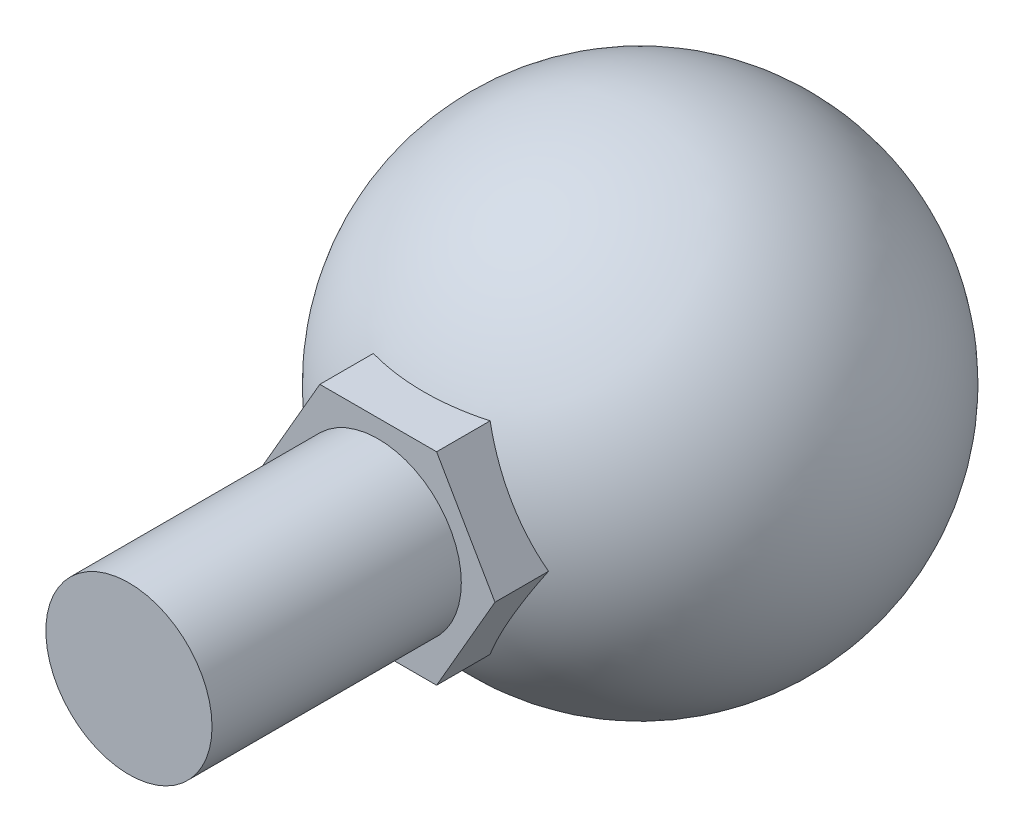
ISO-10303-21;
HEADER;
FILE_DESCRIPTION(('STEP AP214'),'2;1');
FILE_NAME('part.step','',(''),(''),'','','');
FILE_SCHEMA(('AUTOMOTIVE_DESIGN { 1 0 10303 214 1 1 1 1 }'));
ENDSEC;
DATA;
#1=APPLICATION_CONTEXT('core data for automotive mechanical design processes');
#2=APPLICATION_PROTOCOL_DEFINITION('international standard','automotive_design',2000,#1);
#3=PRODUCT_CONTEXT('',#1,'mechanical');
#4=PRODUCT('Part','Part','',(#3));
#5=PRODUCT_RELATED_PRODUCT_CATEGORY('part','',(#4));
#6=PRODUCT_DEFINITION_FORMATION('','',#4);
#7=PRODUCT_DEFINITION_CONTEXT('part definition',#1,'design');
#8=PRODUCT_DEFINITION('design','',#6,#7);
#9=PRODUCT_DEFINITION_SHAPE('','',#8);
#10=(LENGTH_UNIT() NAMED_UNIT(*) SI_UNIT(.MILLI.,.METRE.));
#11=(NAMED_UNIT(*) PLANE_ANGLE_UNIT() SI_UNIT($,.RADIAN.));
#12=(NAMED_UNIT(*) SI_UNIT($,.STERADIAN.) SOLID_ANGLE_UNIT());
#13=UNCERTAINTY_MEASURE_WITH_UNIT(LENGTH_MEASURE(1.E-05),#10,'distance_accuracy_value','');
#14=(GEOMETRIC_REPRESENTATION_CONTEXT(3) GLOBAL_UNCERTAINTY_ASSIGNED_CONTEXT((#13)) GLOBAL_UNIT_ASSIGNED_CONTEXT((#10,
#11,#12)) REPRESENTATION_CONTEXT('',''));
#15=CARTESIAN_POINT('',(0.,0.,0.));
#16=DIRECTION('',(0.,0.,1.));
#17=DIRECTION('',(1.,0.,0.));
#18=AXIS2_PLACEMENT_3D('',#15,#16,#17);
#19=CARTESIAN_POINT('',(0.,0.,24.6101446790841));
#20=DIRECTION('',(0.,0.,1.));
#21=DIRECTION('',(1.,0.,0.));
#22=AXIS2_PLACEMENT_3D('',#19,#20,#21);
#23=CYLINDRICAL_SURFACE('',#22,4.);
#24=CARTESIAN_POINT('',(0.,0.,12.6101446790841));
#25=DIRECTION('',(0.,0.,1.));
#26=DIRECTION('',(1.,0.,0.));
#27=AXIS2_PLACEMENT_3D('',#24,#25,#26);
#28=CIRCLE('',#27,4.);
#29=CARTESIAN_POINT('',(4.,0.,12.6101446790841));
#30=VERTEX_POINT('',#29);
#31=EDGE_CURVE('E115',#30,#30,#28,.T.);
#32=ORIENTED_EDGE('',*,*,#31,.T.);
#33=EDGE_LOOP('',(#32));
#34=FACE_BOUND('',#33,.T.);
#35=CARTESIAN_POINT('',(0.,0.,24.6101446790841));
#36=DIRECTION('',(0.,0.,1.));
#37=DIRECTION('',(1.,0.,0.));
#38=AXIS2_PLACEMENT_3D('',#35,#36,#37);
#39=CIRCLE('',#38,4.);
#40=CARTESIAN_POINT('',(4.,0.,24.6101446790841));
#41=VERTEX_POINT('',#40);
#42=EDGE_CURVE('E121',#41,#41,#39,.T.);
#43=ORIENTED_EDGE('',*,*,#42,.F.);
#44=EDGE_LOOP('',(#43));
#45=FACE_BOUND('',#44,.T.);
#46=ADVANCED_FACE('F41',(#34,#45),#23,.T.);
#47=CARTESIAN_POINT('',(-4.,0.,24.6101446790841));
#48=DIRECTION('',(0.,0.,-1.));
#49=DIRECTION('',(-1.,0.,0.));
#50=AXIS2_PLACEMENT_3D('',#47,#48,#49);
#51=PLANE('',#50);
#52=ORIENTED_EDGE('',*,*,#42,.T.);
#53=EDGE_LOOP('',(#52));
#54=FACE_BOUND('',#53,.T.);
#55=ADVANCED_FACE('F190',(#54),#51,.F.);
#56=CARTESIAN_POINT('',(5.62055704149006,0.,12.6101446790841));
#57=DIRECTION('',(-0.866025403784438,-0.5,0.));
#58=DIRECTION('',(0.5,-0.866025403784439,0.));
#59=AXIS2_PLACEMENT_3D('',#56,#57,#58);
#60=PLANE('',#59);
#61=DIRECTION('',(0.,0.,-1.));
#62=VECTOR('',#61,1.);
#63=CARTESIAN_POINT('',(5.62055704149006,0.,12.6101446790841));
#64=LINE('',#63,#62);
#65=CARTESIAN_POINT('',(5.62055704149006,0.,12.6101446790841));
#66=VERTEX_POINT('',#65);
#67=CARTESIAN_POINT('',(5.62055704149006,0.,10.0329127646639));
#68=VERTEX_POINT('',#67);
#69=EDGE_CURVE('E162',#66,#68,#64,.T.);
#70=ORIENTED_EDGE('',*,*,#69,.T.);
#71=CARTESIAN_POINT('',(4.21541778111754,2.43377259067495,0.));
#72=DIRECTION('',(-0.866025403784438,-0.5,0.));
#73=DIRECTION('',(0.5,-0.866025403784439,0.));
#74=AXIS2_PLACEMENT_3D('',#71,#72,#73);
#75=CIRCLE('',#74,10.4190692438201);
#76=CARTESIAN_POINT('',(2.81027852074503,4.8675451813499,10.0329127646639));
#77=VERTEX_POINT('',#76);
#78=EDGE_CURVE('E11',#68,#77,#75,.T.);
#79=ORIENTED_EDGE('',*,*,#78,.T.);
#80=DIRECTION('',(0.,0.,-1.));
#81=VECTOR('',#80,1.);
#82=CARTESIAN_POINT('',(2.81027852074503,4.8675451813499,12.6101446790841));
#83=LINE('',#82,#81);
#84=CARTESIAN_POINT('',(2.81027852074503,4.8675451813499,12.6101446790841));
#85=VERTEX_POINT('',#84);
#86=EDGE_CURVE('E95',#85,#77,#83,.T.);
#87=ORIENTED_EDGE('',*,*,#86,.F.);
#88=DIRECTION('',(-0.5,0.866025403784439,0.));
#89=VECTOR('',#88,1.);
#90=CARTESIAN_POINT('',(5.62055704149006,0.,12.6101446790841));
#91=LINE('',#90,#89);
#92=EDGE_CURVE('E102',#66,#85,#91,.T.);
#93=ORIENTED_EDGE('',*,*,#92,.F.);
#94=EDGE_LOOP('',(#70,#79,#87,#93));
#95=FACE_BOUND('',#94,.T.);
#96=ADVANCED_FACE('F113',(#95),#60,.F.);
#97=CARTESIAN_POINT('',(2.81027852074503,4.8675451813499,12.6101446790841));
#98=DIRECTION('',(0.,-1.,0.));
#99=DIRECTION('',(1.,0.,0.));
#100=AXIS2_PLACEMENT_3D('',#97,#98,#99);
#101=PLANE('',#100);
#102=ORIENTED_EDGE('',*,*,#86,.T.);
#103=CARTESIAN_POINT('',(0.,4.8675451813499,0.));
#104=DIRECTION('',(0.,-1.,0.));
#105=DIRECTION('',(1.,0.,0.));
#106=AXIS2_PLACEMENT_3D('',#103,#104,#105);
#107=CIRCLE('',#106,10.4190692438201);
#108=CARTESIAN_POINT('',(-2.81027852074503,4.8675451813499,10.0329127646639));
#109=VERTEX_POINT('',#108);
#110=EDGE_CURVE('E50',#77,#109,#107,.T.);
#111=ORIENTED_EDGE('',*,*,#110,.T.);
#112=DIRECTION('',(0.,0.,-1.));
#113=VECTOR('',#112,1.);
#114=CARTESIAN_POINT('',(-2.81027852074503,4.8675451813499,12.6101446790841));
#115=LINE('',#114,#113);
#116=CARTESIAN_POINT('',(-2.81027852074503,4.8675451813499,12.6101446790841));
#117=VERTEX_POINT('',#116);
#118=EDGE_CURVE('E97',#117,#109,#115,.T.);
#119=ORIENTED_EDGE('',*,*,#118,.F.);
#120=DIRECTION('',(-1.,0.,0.));
#121=VECTOR('',#120,1.);
#122=CARTESIAN_POINT('',(2.81027852074503,4.8675451813499,12.6101446790841));
#123=LINE('',#122,#121);
#124=EDGE_CURVE('E91',#85,#117,#123,.T.);
#125=ORIENTED_EDGE('',*,*,#124,.F.);
#126=EDGE_LOOP('',(#102,#111,#119,#125));
#127=FACE_BOUND('',#126,.T.);
#128=ADVANCED_FACE('F93',(#127),#101,.F.);
#129=CARTESIAN_POINT('',(-2.81027852074503,4.8675451813499,12.6101446790841));
#130=DIRECTION('',(0.866025403784439,-0.5,0.));
#131=DIRECTION('',(0.5,0.866025403784439,0.));
#132=AXIS2_PLACEMENT_3D('',#129,#130,#131);
#133=PLANE('',#132);
#134=ORIENTED_EDGE('',*,*,#118,.T.);
#135=CARTESIAN_POINT('',(-4.21541778111755,2.43377259067495,0.));
#136=DIRECTION('',(0.866025403784439,-0.5,0.));
#137=DIRECTION('',(0.5,0.866025403784439,0.));
#138=AXIS2_PLACEMENT_3D('',#135,#136,#137);
#139=CIRCLE('',#138,10.4190692438201);
#140=CARTESIAN_POINT('',(-5.62055704149006,0.,10.0329127646639));
#141=VERTEX_POINT('',#140);
#142=EDGE_CURVE('E60',#109,#141,#139,.T.);
#143=ORIENTED_EDGE('',*,*,#142,.T.);
#144=DIRECTION('',(0.,0.,-1.));
#145=VECTOR('',#144,1.);
#146=CARTESIAN_POINT('',(-5.62055704149006,0.,12.6101446790841));
#147=LINE('',#146,#145);
#148=CARTESIAN_POINT('',(-5.62055704149006,0.,12.6101446790841));
#149=VERTEX_POINT('',#148);
#150=EDGE_CURVE('E123',#149,#141,#147,.T.);
#151=ORIENTED_EDGE('',*,*,#150,.F.);
#152=DIRECTION('',(-0.5,-0.866025403784439,0.));
#153=VECTOR('',#152,1.);
#154=CARTESIAN_POINT('',(-2.81027852074503,4.8675451813499,12.6101446790841));
#155=LINE('',#154,#153);
#156=EDGE_CURVE('E101',#117,#149,#155,.T.);
#157=ORIENTED_EDGE('',*,*,#156,.F.);
#158=EDGE_LOOP('',(#134,#143,#151,#157));
#159=FACE_BOUND('',#158,.T.);
#160=ADVANCED_FACE('F146',(#159),#133,.F.);
#161=CARTESIAN_POINT('',(-5.62055704149006,0.,12.6101446790841));
#162=DIRECTION('',(0.866025403784438,0.5,0.));
#163=DIRECTION('',(-0.5,0.866025403784439,0.));
#164=AXIS2_PLACEMENT_3D('',#161,#162,#163);
#165=PLANE('',#164);
#166=ORIENTED_EDGE('',*,*,#150,.T.);
#167=CARTESIAN_POINT('',(-4.21541778111754,-2.43377259067495,0.));
#168=DIRECTION('',(0.866025403784438,0.5,0.));
#169=DIRECTION('',(-0.5,0.866025403784439,0.));
#170=AXIS2_PLACEMENT_3D('',#167,#168,#169);
#171=CIRCLE('',#170,10.4190692438201);
#172=CARTESIAN_POINT('',(-2.81027852074503,-4.8675451813499,10.0329127646639));
#173=VERTEX_POINT('',#172);
#174=EDGE_CURVE('E138',#141,#173,#171,.T.);
#175=ORIENTED_EDGE('',*,*,#174,.T.);
#176=DIRECTION('',(0.,0.,-1.));
#177=VECTOR('',#176,1.);
#178=CARTESIAN_POINT('',(-2.81027852074503,-4.8675451813499,12.6101446790841));
#179=LINE('',#178,#177);
#180=CARTESIAN_POINT('',(-2.81027852074503,-4.8675451813499,12.6101446790841));
#181=VERTEX_POINT('',#180);
#182=EDGE_CURVE('E169',#181,#173,#179,.T.);
#183=ORIENTED_EDGE('',*,*,#182,.F.);
#184=DIRECTION('',(0.5,-0.866025403784438,0.));
#185=VECTOR('',#184,1.);
#186=CARTESIAN_POINT('',(-5.62055704149006,0.,12.6101446790841));
#187=LINE('',#186,#185);
#188=EDGE_CURVE('E151',#149,#181,#187,.T.);
#189=ORIENTED_EDGE('',*,*,#188,.F.);
#190=EDGE_LOOP('',(#166,#175,#183,#189));
#191=FACE_BOUND('',#190,.T.);
#192=ADVANCED_FACE('F175',(#191),#165,.F.);
#193=CARTESIAN_POINT('',(-2.81027852074503,-4.8675451813499,12.6101446790841));
#194=DIRECTION('',(0.,1.,0.));
#195=DIRECTION('',(-1.,0.,0.));
#196=AXIS2_PLACEMENT_3D('',#193,#194,#195);
#197=PLANE('',#196);
#198=ORIENTED_EDGE('',*,*,#182,.T.);
#199=CARTESIAN_POINT('',(0.,-4.8675451813499,0.));
#200=DIRECTION('',(0.,1.,0.));
#201=DIRECTION('',(-1.,0.,0.));
#202=AXIS2_PLACEMENT_3D('',#199,#200,#201);
#203=CIRCLE('',#202,10.4190692438201);
#204=CARTESIAN_POINT('',(2.81027852074503,-4.8675451813499,10.0329127646639));
#205=VERTEX_POINT('',#204);
#206=EDGE_CURVE('E134',#173,#205,#203,.T.);
#207=ORIENTED_EDGE('',*,*,#206,.T.);
#208=DIRECTION('',(0.,0.,-1.));
#209=VECTOR('',#208,1.);
#210=CARTESIAN_POINT('',(2.81027852074503,-4.8675451813499,12.6101446790841));
#211=LINE('',#210,#209);
#212=CARTESIAN_POINT('',(2.81027852074503,-4.8675451813499,12.6101446790841));
#213=VERTEX_POINT('',#212);
#214=EDGE_CURVE('E165',#213,#205,#211,.T.);
#215=ORIENTED_EDGE('',*,*,#214,.F.);
#216=DIRECTION('',(1.,0.,0.));
#217=VECTOR('',#216,1.);
#218=CARTESIAN_POINT('',(-2.81027852074503,-4.8675451813499,12.6101446790841));
#219=LINE('',#218,#217);
#220=EDGE_CURVE('E155',#181,#213,#219,.T.);
#221=ORIENTED_EDGE('',*,*,#220,.F.);
#222=EDGE_LOOP('',(#198,#207,#215,#221));
#223=FACE_BOUND('',#222,.T.);
#224=ADVANCED_FACE('F180',(#223),#197,.F.);
#225=CARTESIAN_POINT('',(2.81027852074503,-4.8675451813499,12.6101446790841));
#226=DIRECTION('',(-0.866025403784439,0.5,0.));
#227=DIRECTION('',(-0.5,-0.866025403784439,0.));
#228=AXIS2_PLACEMENT_3D('',#225,#226,#227);
#229=PLANE('',#228);
#230=ORIENTED_EDGE('',*,*,#214,.T.);
#231=CARTESIAN_POINT('',(4.21541778111754,-2.43377259067495,0.));
#232=DIRECTION('',(-0.866025403784439,0.5,0.));
#233=DIRECTION('',(-0.5,-0.866025403784439,0.));
#234=AXIS2_PLACEMENT_3D('',#231,#232,#233);
#235=CIRCLE('',#234,10.4190692438201);
#236=EDGE_CURVE('E129',#205,#68,#235,.T.);
#237=ORIENTED_EDGE('',*,*,#236,.T.);
#238=ORIENTED_EDGE('',*,*,#69,.F.);
#239=DIRECTION('',(0.5,0.866025403784439,0.));
#240=VECTOR('',#239,1.);
#241=CARTESIAN_POINT('',(2.81027852074503,-4.8675451813499,12.6101446790841));
#242=LINE('',#241,#240);
#243=EDGE_CURVE('E107',#213,#66,#242,.T.);
#244=ORIENTED_EDGE('',*,*,#243,.F.);
#245=EDGE_LOOP('',(#230,#237,#238,#244));
#246=FACE_BOUND('',#245,.T.);
#247=ADVANCED_FACE('F182',(#246),#229,.F.);
#248=CARTESIAN_POINT('',(0.,0.,12.6101446790841));
#249=DIRECTION('',(0.,0.,1.));
#250=DIRECTION('',(1.,0.,0.));
#251=AXIS2_PLACEMENT_3D('',#248,#249,#250);
#252=PLANE('',#251);
#253=ORIENTED_EDGE('',*,*,#31,.F.);
#254=EDGE_LOOP('',(#253));
#255=FACE_BOUND('',#254,.T.);
#256=ORIENTED_EDGE('',*,*,#92,.T.);
#257=ORIENTED_EDGE('',*,*,#124,.T.);
#258=ORIENTED_EDGE('',*,*,#156,.T.);
#259=ORIENTED_EDGE('',*,*,#188,.T.);
#260=ORIENTED_EDGE('',*,*,#220,.T.);
#261=ORIENTED_EDGE('',*,*,#243,.T.);
#262=EDGE_LOOP('',(#256,#257,#258,#259,#260,#261));
#263=FACE_BOUND('',#262,.T.);
#264=ADVANCED_FACE('F105',(#255,#263),#252,.T.);
#265=CARTESIAN_POINT('',(0.,0.,0.));
#266=DIRECTION('',(0.,0.,1.));
#267=DIRECTION('',(-1.,0.,0.));
#268=AXIS2_PLACEMENT_3D('',#265,#266,#267);
#269=SPHERICAL_SURFACE('',#268,11.5);
#270=ORIENTED_EDGE('',*,*,#78,.F.);
#271=ORIENTED_EDGE('',*,*,#236,.F.);
#272=ORIENTED_EDGE('',*,*,#206,.F.);
#273=ORIENTED_EDGE('',*,*,#174,.F.);
#274=ORIENTED_EDGE('',*,*,#142,.F.);
#275=ORIENTED_EDGE('',*,*,#110,.F.);
#276=EDGE_LOOP('',(#270,#271,#272,#273,#274,#275));
#277=FACE_BOUND('',#276,.T.);
#278=ADVANCED_FACE('F43',(#277),#269,.T.);
#279=CLOSED_SHELL('',(#46,#55,#96,#128,#160,#192,#224,#247,#264,#278));
#280=MANIFOLD_SOLID_BREP('B2',#279);
#281=ADVANCED_BREP_SHAPE_REPRESENTATION('',(#18,#280),#14);
#282=SHAPE_DEFINITION_REPRESENTATION(#9,#281);
ENDSEC;
END-ISO-10303-21;
